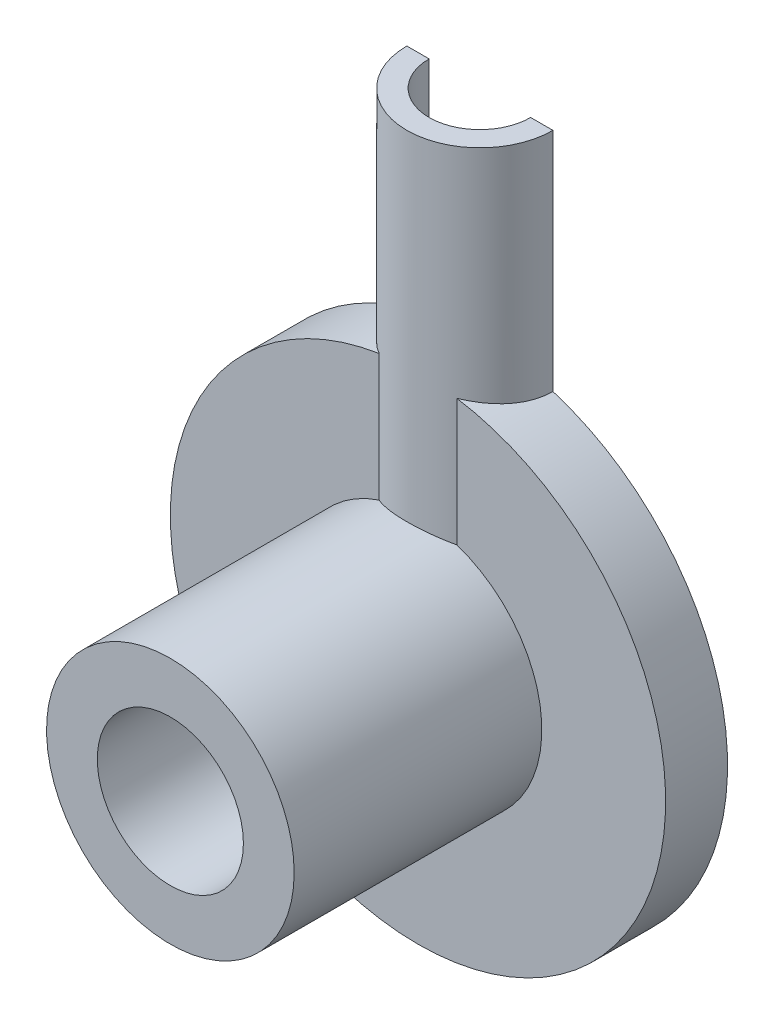
ISO-10303-21;
HEADER;
FILE_DESCRIPTION(('STEP AP214'),'2;1');
FILE_NAME('part.step','',(''),(''),'','','');
FILE_SCHEMA(('AUTOMOTIVE_DESIGN { 1 0 10303 214 1 1 1 1 }'));
ENDSEC;
DATA;
#1=APPLICATION_CONTEXT('core data for automotive mechanical design processes');
#2=APPLICATION_PROTOCOL_DEFINITION('international standard','automotive_design',2000,#1);
#3=PRODUCT_CONTEXT('',#1,'mechanical');
#4=PRODUCT('Part','Part','',(#3));
#5=PRODUCT_RELATED_PRODUCT_CATEGORY('part','',(#4));
#6=PRODUCT_DEFINITION_FORMATION('','',#4);
#7=PRODUCT_DEFINITION_CONTEXT('part definition',#1,'design');
#8=PRODUCT_DEFINITION('design','',#6,#7);
#9=PRODUCT_DEFINITION_SHAPE('','',#8);
#10=(LENGTH_UNIT() NAMED_UNIT(*) SI_UNIT(.MILLI.,.METRE.));
#11=(NAMED_UNIT(*) PLANE_ANGLE_UNIT() SI_UNIT($,.RADIAN.));
#12=(NAMED_UNIT(*) SI_UNIT($,.STERADIAN.) SOLID_ANGLE_UNIT());
#13=UNCERTAINTY_MEASURE_WITH_UNIT(LENGTH_MEASURE(1.E-05),#10,'distance_accuracy_value','');
#14=(GEOMETRIC_REPRESENTATION_CONTEXT(3) GLOBAL_UNCERTAINTY_ASSIGNED_CONTEXT((#13)) GLOBAL_UNIT_ASSIGNED_CONTEXT((#10,
#11,#12)) REPRESENTATION_CONTEXT('',''));
#15=CARTESIAN_POINT('',(0.,0.,0.));
#16=DIRECTION('',(0.,0.,1.));
#17=DIRECTION('',(1.,0.,0.));
#18=AXIS2_PLACEMENT_3D('',#15,#16,#17);
#19=CARTESIAN_POINT('',(102.341205300561,36.4161133887819,0.));
#20=DIRECTION('',(0.,0.,1.));
#21=DIRECTION('',(1.,0.,0.));
#22=AXIS2_PLACEMENT_3D('',#19,#20,#21);
#23=PLANE('',#22);
#24=CARTESIAN_POINT('',(102.341205300561,36.4161133887819,0.));
#25=DIRECTION('',(0.,0.,1.));
#26=DIRECTION('',(1.,0.,0.));
#27=AXIS2_PLACEMENT_3D('',#24,#25,#26);
#28=CIRCLE('',#27,2.95);
#29=CARTESIAN_POINT('',(100.291205300561,38.5374337323416,0.));
#30=VERTEX_POINT('',#29);
#31=CARTESIAN_POINT('',(104.391205300561,38.5374337323416,0.));
#32=VERTEX_POINT('',#31);
#33=EDGE_CURVE('E51',#30,#32,#28,.T.);
#34=ORIENTED_EDGE('',*,*,#33,.T.);
#35=DIRECTION('',(0.,-1.,0.));
#36=VECTOR('',#35,1.);
#37=CARTESIAN_POINT('',(104.391205300561,36.4161133887819,0.));
#38=LINE('',#37,#36);
#39=CARTESIAN_POINT('',(104.391205300561,55.1032781196205,0.));
#40=VERTEX_POINT('',#39);
#41=EDGE_CURVE('E91',#40,#32,#38,.T.);
#42=ORIENTED_EDGE('',*,*,#41,.F.);
#43=DIRECTION('',(-1.,0.,0.));
#44=VECTOR('',#43,1.);
#45=CARTESIAN_POINT('',(99.3912053005615,55.1032781196205,0.));
#46=LINE('',#45,#44);
#47=CARTESIAN_POINT('',(105.291205300561,55.1032781196205,0.));
#48=VERTEX_POINT('',#47);
#49=EDGE_CURVE('E114',#48,#40,#46,.T.);
#50=ORIENTED_EDGE('',*,*,#49,.F.);
#51=DIRECTION('',(0.,-1.,0.));
#52=VECTOR('',#51,1.);
#53=CARTESIAN_POINT('',(105.291205300561,36.4161133887819,0.));
#54=LINE('',#53,#52);
#55=CARTESIAN_POINT('',(105.291205300561,45.971085916215,0.));
#56=VERTEX_POINT('',#55);
#57=EDGE_CURVE('E105',#48,#56,#54,.T.);
#58=ORIENTED_EDGE('',*,*,#57,.T.);
#59=CARTESIAN_POINT('',(102.341205300561,36.4161133887819,0.));
#60=DIRECTION('',(0.,0.,1.));
#61=DIRECTION('',(1.,0.,0.));
#62=AXIS2_PLACEMENT_3D('',#59,#60,#61);
#63=CIRCLE('',#62,9.99999999999999);
#64=CARTESIAN_POINT('',(99.3912053005615,45.971085916215,0.));
#65=VERTEX_POINT('',#64);
#66=EDGE_CURVE('E95',#65,#56,#63,.T.);
#67=ORIENTED_EDGE('',*,*,#66,.F.);
#68=DIRECTION('',(0.,-1.,0.));
#69=VECTOR('',#68,1.);
#70=CARTESIAN_POINT('',(99.3912053005615,36.4161133887819,0.));
#71=LINE('',#70,#69);
#72=CARTESIAN_POINT('',(99.3912053005615,55.1032781196205,0.));
#73=VERTEX_POINT('',#72);
#74=EDGE_CURVE('E111',#73,#65,#71,.T.);
#75=ORIENTED_EDGE('',*,*,#74,.F.);
#76=CARTESIAN_POINT('',(100.291205300561,55.1032781196205,0.));
#77=VERTEX_POINT('',#76);
#78=EDGE_CURVE('E113',#77,#73,#46,.T.);
#79=ORIENTED_EDGE('',*,*,#78,.F.);
#80=DIRECTION('',(0.,-1.,0.));
#81=VECTOR('',#80,1.);
#82=CARTESIAN_POINT('',(100.291205300561,36.4161133887819,0.));
#83=LINE('',#82,#81);
#84=EDGE_CURVE('E94',#30,#77,#83,.F.);
#85=ORIENTED_EDGE('',*,*,#84,.F.);
#86=EDGE_LOOP('',(#34,#42,#50,#58,#67,#75,#79,#85));
#87=FACE_BOUND('',#86,.T.);
#88=ADVANCED_FACE('F32',(#87),#23,.F.);
#89=CARTESIAN_POINT('',(102.341205300561,36.4161133887819,2.5));
#90=DIRECTION('',(0.,0.,1.));
#91=DIRECTION('',(1.,0.,0.));
#92=AXIS2_PLACEMENT_3D('',#89,#90,#91);
#93=PLANE('',#92);
#94=DIRECTION('',(0.,1.,0.));
#95=VECTOR('',#94,1.);
#96=CARTESIAN_POINT('',(103.907251276898,36.4161133887819,2.5));
#97=LINE('',#96,#95);
#98=CARTESIAN_POINT('',(103.907251276898,41.1645341788973,2.5));
#99=VERTEX_POINT('',#98);
#100=CARTESIAN_POINT('',(103.907251276898,46.292727180968,2.5));
#101=VERTEX_POINT('',#100);
#102=EDGE_CURVE('E120',#99,#101,#97,.T.);
#103=ORIENTED_EDGE('',*,*,#102,.F.);
#104=CARTESIAN_POINT('',(102.341205300561,36.4161133887819,2.5));
#105=DIRECTION('',(0.,0.,1.));
#106=DIRECTION('',(1.,0.,0.));
#107=AXIS2_PLACEMENT_3D('',#104,#105,#106);
#108=CIRCLE('',#107,5.00000000000001);
#109=CARTESIAN_POINT('',(100.775159324225,41.1645341788973,2.5));
#110=VERTEX_POINT('',#109);
#111=EDGE_CURVE('E245',#110,#99,#108,.T.);
#112=ORIENTED_EDGE('',*,*,#111,.F.);
#113=DIRECTION('',(0.,1.,0.));
#114=VECTOR('',#113,1.);
#115=CARTESIAN_POINT('',(100.775159324225,36.4161133887819,2.5));
#116=LINE('',#115,#114);
#117=CARTESIAN_POINT('',(100.775159324225,46.292727180968,2.5));
#118=VERTEX_POINT('',#117);
#119=EDGE_CURVE('E59',#118,#110,#116,.F.);
#120=ORIENTED_EDGE('',*,*,#119,.F.);
#121=CARTESIAN_POINT('',(102.341205300561,36.4161133887819,2.5));
#122=DIRECTION('',(0.,0.,1.));
#123=DIRECTION('',(1.,0.,0.));
#124=AXIS2_PLACEMENT_3D('',#121,#122,#123);
#125=CIRCLE('',#124,9.99999999999999);
#126=EDGE_CURVE('E148',#118,#101,#125,.T.);
#127=ORIENTED_EDGE('',*,*,#126,.T.);
#128=EDGE_LOOP('',(#103,#112,#120,#127));
#129=FACE_BOUND('',#128,.T.);
#130=ADVANCED_FACE('F158',(#129),#93,.T.);
#131=CARTESIAN_POINT('',(102.341205300561,36.4161133887819,2.5));
#132=DIRECTION('',(0.,0.,-1.));
#133=DIRECTION('',(-1.,0.,0.));
#134=AXIS2_PLACEMENT_3D('',#131,#132,#133);
#135=CYLINDRICAL_SURFACE('',#134,9.99999999999999);
#136=ORIENTED_EDGE('',*,*,#126,.F.);
#137=CARTESIAN_POINT('',(100.775159324225,46.292727180968,2.5));
#138=CARTESIAN_POINT('',(100.704194195334,46.2814772425057,2.45554279678611));
#139=CARTESIAN_POINT('',(100.635212868172,46.2697526474675,2.40812508415476));
#140=CARTESIAN_POINT('',(100.501596262966,46.245682969601,2.30766861515076));
#141=CARTESIAN_POINT('',(100.436960625252,46.2333379382711,2.2546303249035));
#142=CARTESIAN_POINT('',(100.250214291646,46.1958807768057,2.08760463678293));
#143=CARTESIAN_POINT('',(100.135158643295,46.1703290573299,1.96564011633931));
#144=CARTESIAN_POINT('',(99.9271466281976,46.1209477185642,1.70377766472849));
#145=CARTESIAN_POINT('',(99.8342086434137,46.0971195430771,1.56386496443432));
#146=CARTESIAN_POINT('',(99.6732141543941,46.0539969841537,1.26977252514159));
#147=CARTESIAN_POINT('',(99.605131542695,46.0346978511817,1.11560797055584));
#148=CARTESIAN_POINT('',(99.524402410683,46.0112343192677,0.880163149414047));
#149=CARTESIAN_POINT('',(99.5013224954502,46.004413149373,0.802576913807776));
#150=CARTESIAN_POINT('',(99.4615849668327,45.9925542695048,0.645623295426268));
#151=CARTESIAN_POINT('',(99.4449269828549,45.9875164566198,0.566256015710263));
#152=CARTESIAN_POINT('',(99.4181535956341,45.9793751509979,0.406059855867925));
#153=CARTESIAN_POINT('',(99.4080600938059,45.9762781346787,0.325226998546827));
#154=CARTESIAN_POINT('',(99.3945800157951,45.9721276276064,0.162931761758962));
#155=CARTESIAN_POINT('',(99.3911951514591,45.9710746584354,0.0814692269391979));
#156=CARTESIAN_POINT('',(99.3912053005615,45.971085916215,0.));
#157=B_SPLINE_CURVE_WITH_KNOTS('',3,(#137,#138,#139,#140,#141,#142,#143,#144,#145,#146,#147,
#148,#149,#150,#151,#152,#153,#154,#155,#156),.UNSPECIFIED.,.F.,.F.,(4,2,2,2,2,2,2,2,2,4),(0.,
0.253314553142576,0.506608114834949,1.01282243248599,1.51945600635706,2.02555588337911,
2.26901863108148,2.51246732707562,2.75672414232353,3.00104327669344),.UNSPECIFIED.);
#158=EDGE_CURVE('E129',#118,#65,#157,.T.);
#159=ORIENTED_EDGE('',*,*,#158,.T.);
#160=ORIENTED_EDGE('',*,*,#66,.T.);
#161=CARTESIAN_POINT('',(105.291205300561,45.971085916215,0.));
#162=CARTESIAN_POINT('',(105.29121547173,45.9710748094381,0.0810765861532619));
#163=CARTESIAN_POINT('',(105.287863119583,45.9721175884658,0.162146986807946));
#164=CARTESIAN_POINT('',(105.274511971824,45.9762285025136,0.3236694396762));
#165=CARTESIAN_POINT('',(105.264514653061,45.9792961874958,0.404121625270425));
#166=CARTESIAN_POINT('',(105.237999961192,45.9873600132744,0.563550503018594));
#167=CARTESIAN_POINT('',(105.221506208567,45.9923491663336,0.642531466833053));
#168=CARTESIAN_POINT('',(105.182157692093,46.0040958495714,0.798739043140728));
#169=CARTESIAN_POINT('',(105.159302761035,46.0108534262343,0.875965609460362));
#170=CARTESIAN_POINT('',(105.081470175298,46.033488768198,1.10418877810362));
#171=CARTESIAN_POINT('',(105.017197608452,46.0517379202675,1.25189012626787));
#172=CARTESIAN_POINT('',(104.865757446785,46.09251457367,1.53456594773176));
#173=CARTESIAN_POINT('',(104.77856412473,46.1150468746732,1.66952588670087));
#174=CARTESIAN_POINT('',(104.627853689652,46.1513201090872,1.86585977417803));
#175=CARTESIAN_POINT('',(104.571446584999,46.1644317821157,1.93292374515025));
#176=CARTESIAN_POINT('',(104.452892731755,46.1907982231592,2.0617796264806));
#177=CARTESIAN_POINT('',(104.390745477095,46.2040530036999,2.12357107106998));
#178=CARTESIAN_POINT('',(104.261135275324,46.2302988298584,2.24143828972763));
#179=CARTESIAN_POINT('',(104.193669289136,46.2432897192814,2.29751075343532));
#180=CARTESIAN_POINT('',(104.053938167379,46.2686060439725,2.40348609642808));
#181=CARTESIAN_POINT('',(103.981673007045,46.2809314758064,2.453388943875));
#182=CARTESIAN_POINT('',(103.907251276898,46.292727180968,2.5));
#183=B_SPLINE_CURVE_WITH_KNOTS('',3,(#161,#162,#163,#164,#165,#166,#167,#168,#169,#170,#171,
#172,#173,#174,#175,#176,#177,#178,#179,#180,#181,#182),.UNSPECIFIED.,.F.,.F.,(4,2,2,2,2,2,2,2,
2,2,4),(0.,0.243143293628724,0.486232566534172,0.728446027740777,0.970665856339611,
1.45462041428258,1.93912052029685,2.20464669556522,2.47019630287096,2.73589875815265,
3.00160258452813),.UNSPECIFIED.);
#184=EDGE_CURVE('E122',#56,#101,#183,.T.);
#185=ORIENTED_EDGE('',*,*,#184,.T.);
#186=EDGE_LOOP('',(#136,#159,#160,#185));
#187=FACE_BOUND('',#186,.T.);
#188=ADVANCED_FACE('F34',(#187),#135,.T.);
#189=CARTESIAN_POINT('',(102.341205300561,36.4161133887819,2.5));
#190=DIRECTION('',(0.,0.,-1.));
#191=DIRECTION('',(-1.,0.,0.));
#192=AXIS2_PLACEMENT_3D('',#189,#190,#191);
#193=CYLINDRICAL_SURFACE('',#192,2.95);
#194=ORIENTED_EDGE('',*,*,#33,.F.);
#195=CARTESIAN_POINT('',(100.291205300561,38.5374337323416,0.));
#196=CARTESIAN_POINT('',(100.291191388144,38.5374028489784,0.0497229932604465));
#197=CARTESIAN_POINT('',(100.293013706388,38.5391811627881,0.0994261901345338));
#198=CARTESIAN_POINT('',(100.300218268906,38.546117223159,0.198261934757859));
#199=CARTESIAN_POINT('',(100.305595013713,38.5512697489673,0.247395244936108));
#200=CARTESIAN_POINT('',(100.319719949287,38.5646441238506,0.344191743167505));
#201=CARTESIAN_POINT('',(100.328431159295,38.5728322761387,0.391865070817324));
#202=CARTESIAN_POINT('',(100.349055603339,38.5918978263919,0.485964667506835));
#203=CARTESIAN_POINT('',(100.360969933139,38.6027761445411,0.532390503799483));
#204=CARTESIAN_POINT('',(100.401081236266,38.6386563668717,0.668851472106618));
#205=CARTESIAN_POINT('',(100.433746853813,38.6670052432555,0.756730564081301));
#206=CARTESIAN_POINT('',(100.509791708058,38.7293025892387,0.925778309664524));
#207=CARTESIAN_POINT('',(100.55320419368,38.7632683260561,1.00692507425598));
#208=CARTESIAN_POINT('',(100.658073426457,38.8398428663531,1.17515578975158));
#209=CARTESIAN_POINT('',(100.721345085681,38.8829375770376,1.26089053875517));
#210=CARTESIAN_POINT('',(100.86044555851,38.9688664632308,1.42167463064048));
#211=CARTESIAN_POINT('',(100.936281069992,39.0117004870697,1.49671823409373));
#212=CARTESIAN_POINT('',(101.113277616711,39.1005180262806,1.64627324419612));
#213=CARTESIAN_POINT('',(101.216552056964,39.1458727338441,1.71869455496209));
#214=CARTESIAN_POINT('',(101.437556100783,39.2267501927058,1.844448649009));
#215=CARTESIAN_POINT('',(101.555258440762,39.262291087358,1.89781671137806));
#216=CARTESIAN_POINT('',(101.768846155856,39.3115482237021,1.97079949547137));
#217=CARTESIAN_POINT('',(101.862208649585,39.3285549518356,1.99561623842462));
#218=CARTESIAN_POINT('',(102.052653566098,39.3535324667699,2.03189782256183));
#219=CARTESIAN_POINT('',(102.149732933198,39.3615105179698,2.04337339814208));
#220=CARTESIAN_POINT('',(102.345035696672,39.3677316513359,2.05233051322633));
#221=CARTESIAN_POINT('',(102.443260902139,39.3659563855733,2.04978567752329));
#222=CARTESIAN_POINT('',(102.637706658068,39.352793334648,2.03079667715978));
#223=CARTESIAN_POINT('',(102.733926625814,39.3414027941442,2.01434852838159));
#224=CARTESIAN_POINT('',(102.919652265253,39.3103459480244,1.96897120823939));
#225=CARTESIAN_POINT('',(103.00925836339,39.2908647120202,1.94032080361139));
#226=CARTESIAN_POINT('',(103.18220795091,39.2451109080488,1.87186372210979));
#227=CARTESIAN_POINT('',(103.265550284999,39.2188370911989,1.83205499355516));
#228=CARTESIAN_POINT('',(103.4337784808,39.1579484233593,1.73755947824675));
#229=CARTESIAN_POINT('',(103.517784516951,39.1227279218727,1.68170319685582));
#230=CARTESIAN_POINT('',(103.675766628319,39.0484288234642,1.55931102725686));
#231=CARTESIAN_POINT('',(103.749731476988,39.0093459912302,1.49276336405786));
#232=CARTESIAN_POINT('',(103.899119683769,38.9229221088327,1.33752620873161));
#233=CARTESIAN_POINT('',(103.972502278038,38.8753396590882,1.24700146951695));
#234=CARTESIAN_POINT('',(104.103531271737,38.783202823482,1.05372087024908));
#235=CARTESIAN_POINT('',(104.161179453105,38.7386480951577,0.950966397118767));
#236=CARTESIAN_POINT('',(104.247553189169,38.6679346528423,0.759381811270089));
#237=CARTESIAN_POINT('',(104.279887371496,38.6399077267937,0.672874618837806));
#238=CARTESIAN_POINT('',(104.332891343032,38.5925697681887,0.494261577264287));
#239=CARTESIAN_POINT('',(104.353604611954,38.5732263014841,0.402178045154352));
#240=CARTESIAN_POINT('',(104.375585227078,38.5524443871157,0.2577305535951));
#241=CARTESIAN_POINT('',(104.381415073123,38.5468626324035,0.206617103166627));
#242=CARTESIAN_POINT('',(104.389236349208,38.5393372148782,0.103684471811222));
#243=CARTESIAN_POINT('',(104.39121653621,38.5374042088145,0.0518636675268006));
#244=CARTESIAN_POINT('',(104.391205300561,38.5374337323416,0.));
#245=B_SPLINE_CURVE_WITH_KNOTS('',3,(#195,#196,#197,#198,#199,#200,#201,#202,#203,#204,#205,
#206,#207,#208,#209,#210,#211,#212,#213,#214,#215,#216,#217,#218,#219,#220,#221,#222,#223,#224,
#225,#226,#227,#228,#229,#230,#231,#232,#233,#234,#235,#236,#237,#238,#239,#240,#241,#242,#243,
#244),.UNSPECIFIED.,.F.,.F.,(4,2,2,2,2,2,2,2,2,2,2,2,2,2,2,2,2,2,2,2,2,2,2,2,4),(0.,
0.149071975470483,0.29791384241196,0.445150692554267,0.592437975585357,0.885011303683552,
1.1785013695804,1.52206571484199,1.86581380954307,2.26572353424402,2.66488889611475,
2.95789537848941,3.25066594228261,3.5439874540901,3.83739304828577,4.12442766574667,
4.41151509492283,4.73087768008277,5.05059443845871,5.42666358039449,5.80269011446823,
6.09122595546038,6.3786749128955,6.53366369593125,6.68910445207092),.UNSPECIFIED.);
#246=EDGE_CURVE('E11',#30,#32,#245,.T.);
#247=ORIENTED_EDGE('',*,*,#246,.T.);
#248=EDGE_LOOP('',(#194,#247));
#249=FACE_BOUND('',#248,.T.);
#250=CARTESIAN_POINT('',(102.341205300561,36.4161133887819,12.5));
#251=DIRECTION('',(0.,0.,1.));
#252=DIRECTION('',(1.,0.,0.));
#253=AXIS2_PLACEMENT_3D('',#250,#251,#252);
#254=CIRCLE('',#253,2.95);
#255=CARTESIAN_POINT('',(105.291205300561,36.4161133887819,12.5));
#256=VERTEX_POINT('',#255);
#257=EDGE_CURVE('E248',#256,#256,#254,.T.);
#258=ORIENTED_EDGE('',*,*,#257,.T.);
#259=EDGE_LOOP('',(#258));
#260=FACE_BOUND('',#259,.T.);
#261=ADVANCED_FACE('F98',(#249,#260),#193,.F.);
#262=CARTESIAN_POINT('',(102.341205300561,36.4161133887819,12.5));
#263=DIRECTION('',(0.,0.,1.));
#264=DIRECTION('',(1.,0.,0.));
#265=AXIS2_PLACEMENT_3D('',#262,#263,#264);
#266=PLANE('',#265);
#267=CARTESIAN_POINT('',(102.341205300561,36.4161133887819,12.5));
#268=DIRECTION('',(0.,0.,1.));
#269=DIRECTION('',(1.,0.,0.));
#270=AXIS2_PLACEMENT_3D('',#267,#268,#269);
#271=CIRCLE('',#270,5.00000000000001);
#272=CARTESIAN_POINT('',(107.341205300561,36.4161133887819,12.5));
#273=VERTEX_POINT('',#272);
#274=EDGE_CURVE('E96',#273,#273,#271,.T.);
#275=ORIENTED_EDGE('',*,*,#274,.T.);
#276=EDGE_LOOP('',(#275));
#277=FACE_BOUND('',#276,.T.);
#278=ORIENTED_EDGE('',*,*,#257,.F.);
#279=EDGE_LOOP('',(#278));
#280=FACE_BOUND('',#279,.T.);
#281=ADVANCED_FACE('F154',(#277,#280),#266,.T.);
#282=CARTESIAN_POINT('',(102.341205300561,36.4161133887819,12.5));
#283=DIRECTION('',(0.,0.,-1.));
#284=DIRECTION('',(-1.,0.,0.));
#285=AXIS2_PLACEMENT_3D('',#282,#283,#284);
#286=CYLINDRICAL_SURFACE('',#285,5.00000000000001);
#287=ORIENTED_EDGE('',*,*,#274,.F.);
#288=EDGE_LOOP('',(#287));
#289=FACE_BOUND('',#288,.T.);
#290=ORIENTED_EDGE('',*,*,#111,.T.);
#291=CARTESIAN_POINT('',(103.907251276898,41.1645341788973,2.5));
#292=CARTESIAN_POINT('',(103.844630644066,41.1851935063579,2.53923044127478));
#293=CARTESIAN_POINT('',(103.780323173064,41.2050219027384,2.5762333256026));
#294=CARTESIAN_POINT('',(103.648595417205,41.2426452625604,2.64551866623332));
#295=CARTESIAN_POINT('',(103.581173335155,41.2604390308735,2.67779835123817));
#296=CARTESIAN_POINT('',(103.443336458003,41.2936482379752,2.73741830232633));
#297=CARTESIAN_POINT('',(103.372912983365,41.3090560845336,2.76474284602785));
#298=CARTESIAN_POINT('',(103.229712237773,41.3370779581126,2.81403621475144));
#299=CARTESIAN_POINT('',(103.156935419979,41.3496925193795,2.83600606399849));
#300=CARTESIAN_POINT('',(102.93514012972,41.3829571526807,2.89362365673674));
#301=CARTESIAN_POINT('',(102.783063320047,41.3989275222216,2.9208022994848));
#302=CARTESIAN_POINT('',(102.47609835478,41.4166533144564,2.95094005394022));
#303=CARTESIAN_POINT('',(102.321217476181,41.418441372872,2.95395477079857));
#304=CARTESIAN_POINT('',(102.023028482778,41.4080704482497,2.93635379035835));
#305=CARTESIAN_POINT('',(101.879600722326,41.396773780915,2.91719916838391));
#306=CARTESIAN_POINT('',(101.598200010152,41.3626336195215,2.85851854491207));
#307=CARTESIAN_POINT('',(101.460235200325,41.3397735419471,2.81896328450088));
#308=CARTESIAN_POINT('',(101.229325869567,41.2919370211449,2.73441418030958));
#309=CARTESIAN_POINT('',(101.134275617918,41.2691946241969,2.69376515663493));
#310=CARTESIAN_POINT('',(100.95015768663,41.2196627111958,2.60345242303017));
#311=CARTESIAN_POINT('',(100.86106767233,41.192889686925,2.55382528845344));
#312=CARTESIAN_POINT('',(100.775159324225,41.1645341788973,2.5));
#313=B_SPLINE_CURVE_WITH_KNOTS('',3,(#291,#292,#293,#294,#295,#296,#297,#298,#299,#300,#301,
#302,#303,#304,#305,#306,#307,#308,#309,#310,#311,#312),.UNSPECIFIED.,.F.,.F.,(4,2,2,2,2,2,2,2,
2,2,4),(0.,0.230148517277996,0.460431535405822,0.691432909843123,0.922390064505585,
1.38565064736588,1.84784488481537,2.28123246602803,2.71524335412462,3.03218756470096,
3.3478685383418),.UNSPECIFIED.);
#314=EDGE_CURVE('E46',#99,#110,#313,.T.);
#315=ORIENTED_EDGE('',*,*,#314,.T.);
#316=EDGE_LOOP('',(#290,#315));
#317=FACE_BOUND('',#316,.T.);
#318=ADVANCED_FACE('F150',(#289,#317),#286,.T.);
#319=CARTESIAN_POINT('',(99.3912053005615,55.1032781196205,0.));
#320=DIRECTION('',(0.,1.,0.));
#321=DIRECTION('',(0.,0.,1.));
#322=AXIS2_PLACEMENT_3D('',#319,#320,#321);
#323=PLANE('',#322);
#324=ORIENTED_EDGE('',*,*,#49,.T.);
#325=CARTESIAN_POINT('',(102.341205300561,55.1032781196205,0.));
#326=DIRECTION('',(0.,-1.,0.));
#327=DIRECTION('',(0.,0.,-1.));
#328=AXIS2_PLACEMENT_3D('',#325,#326,#327);
#329=CIRCLE('',#328,2.05);
#330=EDGE_CURVE('E103',#40,#77,#329,.T.);
#331=ORIENTED_EDGE('',*,*,#330,.T.);
#332=ORIENTED_EDGE('',*,*,#78,.T.);
#333=CARTESIAN_POINT('',(102.341205300561,55.1032781196205,0.));
#334=DIRECTION('',(0.,1.,0.));
#335=DIRECTION('',(0.,0.,1.));
#336=AXIS2_PLACEMENT_3D('',#333,#334,#335);
#337=CIRCLE('',#336,2.94999999999999);
#338=EDGE_CURVE('E116',#73,#48,#337,.T.);
#339=ORIENTED_EDGE('',*,*,#338,.T.);
#340=EDGE_LOOP('',(#324,#331,#332,#339));
#341=FACE_BOUND('',#340,.T.);
#342=ADVANCED_FACE('F138',(#341),#323,.T.);
#343=CARTESIAN_POINT('',(102.341205300561,36.4161133887819,0.));
#344=DIRECTION('',(0.,1.,0.));
#345=DIRECTION('',(0.,0.,1.));
#346=AXIS2_PLACEMENT_3D('',#343,#344,#345);
#347=CYLINDRICAL_SURFACE('',#346,2.94999999999999);
#348=ORIENTED_EDGE('',*,*,#158,.F.);
#349=ORIENTED_EDGE('',*,*,#119,.T.);
#350=ORIENTED_EDGE('',*,*,#314,.F.);
#351=ORIENTED_EDGE('',*,*,#102,.T.);
#352=ORIENTED_EDGE('',*,*,#184,.F.);
#353=ORIENTED_EDGE('',*,*,#57,.F.);
#354=ORIENTED_EDGE('',*,*,#338,.F.);
#355=ORIENTED_EDGE('',*,*,#74,.T.);
#356=EDGE_LOOP('',(#348,#349,#350,#351,#352,#353,#354,#355));
#357=FACE_BOUND('',#356,.T.);
#358=ADVANCED_FACE('F134',(#357),#347,.T.);
#359=CARTESIAN_POINT('',(102.341205300561,36.4161133887819,0.));
#360=DIRECTION('',(0.,-1.,0.));
#361=DIRECTION('',(0.,0.,-1.));
#362=AXIS2_PLACEMENT_3D('',#359,#360,#361);
#363=CYLINDRICAL_SURFACE('',#362,2.05);
#364=ORIENTED_EDGE('',*,*,#246,.F.);
#365=ORIENTED_EDGE('',*,*,#84,.T.);
#366=ORIENTED_EDGE('',*,*,#330,.F.);
#367=ORIENTED_EDGE('',*,*,#41,.T.);
#368=EDGE_LOOP('',(#364,#365,#366,#367));
#369=FACE_BOUND('',#368,.T.);
#370=ADVANCED_FACE('F101',(#369),#363,.F.);
#371=CLOSED_SHELL('',(#88,#130,#188,#261,#281,#318,#342,#358,#370));
#372=MANIFOLD_SOLID_BREP('B2',#371);
#373=ADVANCED_BREP_SHAPE_REPRESENTATION('',(#18,#372),#14);
#374=SHAPE_DEFINITION_REPRESENTATION(#9,#373);
ENDSEC;
END-ISO-10303-21;
